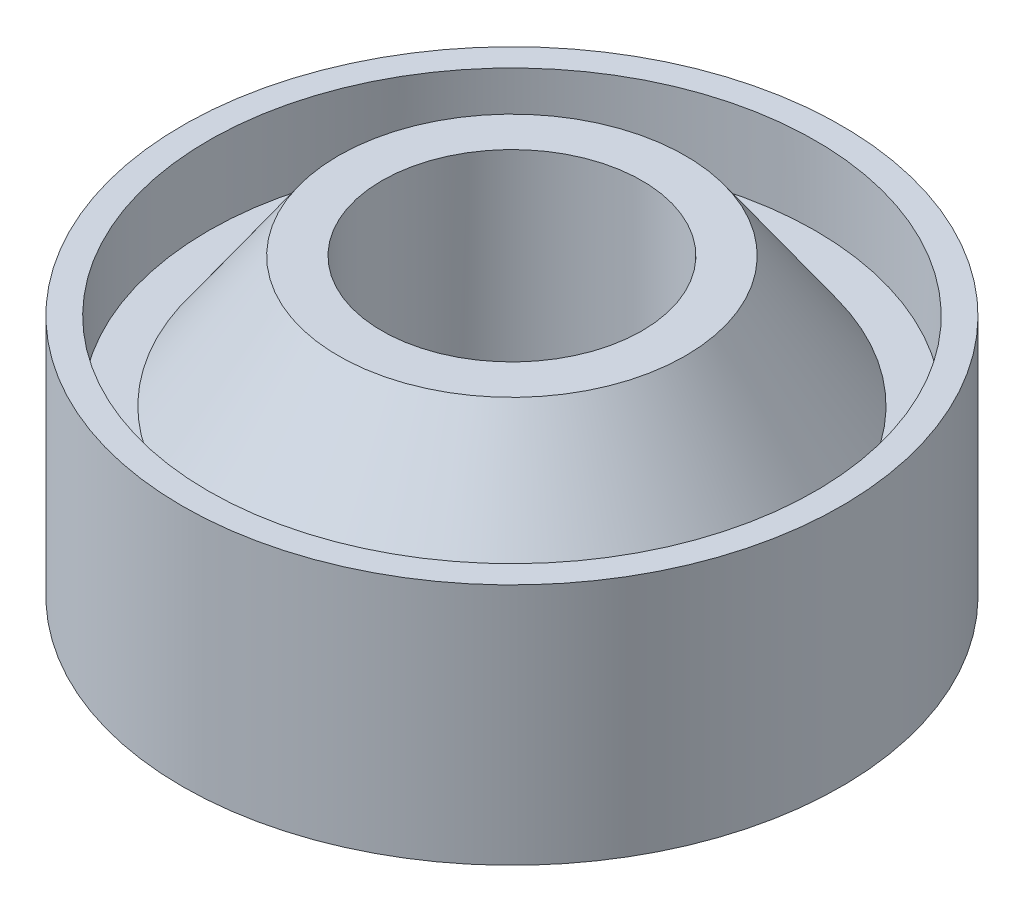
ISO-10303-21;
HEADER;
FILE_DESCRIPTION(('STEP AP214'),'2;1');
FILE_NAME('part.step','',(''),(''),'','','');
FILE_SCHEMA(('AUTOMOTIVE_DESIGN { 1 0 10303 214 1 1 1 1 }'));
ENDSEC;
DATA;
#1=APPLICATION_CONTEXT('core data for automotive mechanical design processes');
#2=APPLICATION_PROTOCOL_DEFINITION('international standard','automotive_design',2000,#1);
#3=PRODUCT_CONTEXT('',#1,'mechanical');
#4=PRODUCT('Part','Part','',(#3));
#5=PRODUCT_RELATED_PRODUCT_CATEGORY('part','',(#4));
#6=PRODUCT_DEFINITION_FORMATION('','',#4);
#7=PRODUCT_DEFINITION_CONTEXT('part definition',#1,'design');
#8=PRODUCT_DEFINITION('design','',#6,#7);
#9=PRODUCT_DEFINITION_SHAPE('','',#8);
#10=(LENGTH_UNIT() NAMED_UNIT(*) SI_UNIT(.MILLI.,.METRE.));
#11=(NAMED_UNIT(*) PLANE_ANGLE_UNIT() SI_UNIT($,.RADIAN.));
#12=(NAMED_UNIT(*) SI_UNIT($,.STERADIAN.) SOLID_ANGLE_UNIT());
#13=UNCERTAINTY_MEASURE_WITH_UNIT(LENGTH_MEASURE(1.E-05),#10,'distance_accuracy_value','');
#14=(GEOMETRIC_REPRESENTATION_CONTEXT(3) GLOBAL_UNCERTAINTY_ASSIGNED_CONTEXT((#13)) GLOBAL_UNIT_ASSIGNED_CONTEXT((#10,
#11,#12)) REPRESENTATION_CONTEXT('',''));
#15=CARTESIAN_POINT('',(0.,0.,0.));
#16=DIRECTION('',(0.,0.,1.));
#17=DIRECTION('',(1.,0.,0.));
#18=AXIS2_PLACEMENT_3D('',#15,#16,#17);
#19=CARTESIAN_POINT('',(0.,-14.,0.));
#20=DIRECTION('',(0.,1.,0.));
#21=DIRECTION('',(0.,0.,1.));
#22=AXIS2_PLACEMENT_3D('',#19,#20,#21);
#23=CYLINDRICAL_SURFACE('',#22,35.);
#24=CARTESIAN_POINT('',(0.,14.,0.));
#25=DIRECTION('',(0.,1.,0.));
#26=DIRECTION('',(0.,0.,1.));
#27=AXIS2_PLACEMENT_3D('',#24,#25,#26);
#28=CIRCLE('',#27,35.);
#29=CARTESIAN_POINT('',(0.,14.,35.));
#30=VERTEX_POINT('',#29);
#31=EDGE_CURVE('E58',#30,#30,#28,.T.);
#32=ORIENTED_EDGE('',*,*,#31,.T.);
#33=EDGE_LOOP('',(#32));
#34=FACE_BOUND('',#33,.T.);
#35=CARTESIAN_POINT('',(0.,5.,0.));
#36=DIRECTION('',(0.,-1.,0.));
#37=DIRECTION('',(1.,0.,0.));
#38=AXIS2_PLACEMENT_3D('',#35,#36,#37);
#39=CIRCLE('',#38,35.);
#40=CARTESIAN_POINT('',(35.,4.99999999999975,0.));
#41=VERTEX_POINT('',#40);
#42=EDGE_CURVE('E44',#41,#41,#39,.F.);
#43=ORIENTED_EDGE('',*,*,#42,.F.);
#44=EDGE_LOOP('',(#43));
#45=FACE_BOUND('',#44,.T.);
#46=ADVANCED_FACE('F40',(#34,#45),#23,.F.);
#47=CARTESIAN_POINT('',(0.,-14.,0.));
#48=DIRECTION('',(0.,1.,0.));
#49=DIRECTION('',(0.,0.,1.));
#50=AXIS2_PLACEMENT_3D('',#47,#48,#49);
#51=CYLINDRICAL_SURFACE('',#50,38.);
#52=CARTESIAN_POINT('',(0.,-14.,0.));
#53=DIRECTION('',(0.,1.,0.));
#54=DIRECTION('',(0.,0.,1.));
#55=AXIS2_PLACEMENT_3D('',#52,#53,#54);
#56=CIRCLE('',#55,38.);
#57=CARTESIAN_POINT('',(0.,-14.,38.));
#58=VERTEX_POINT('',#57);
#59=EDGE_CURVE('E47',#58,#58,#56,.T.);
#60=ORIENTED_EDGE('',*,*,#59,.T.);
#61=EDGE_LOOP('',(#60));
#62=FACE_BOUND('',#61,.T.);
#63=CARTESIAN_POINT('',(0.,14.,0.));
#64=DIRECTION('',(0.,1.,0.));
#65=DIRECTION('',(0.,0.,1.));
#66=AXIS2_PLACEMENT_3D('',#63,#64,#65);
#67=CIRCLE('',#66,38.);
#68=CARTESIAN_POINT('',(0.,14.,38.));
#69=VERTEX_POINT('',#68);
#70=EDGE_CURVE('E60',#69,#69,#67,.T.);
#71=ORIENTED_EDGE('',*,*,#70,.F.);
#72=EDGE_LOOP('',(#71));
#73=FACE_BOUND('',#72,.T.);
#74=ADVANCED_FACE('F99',(#62,#73),#51,.T.);
#75=CARTESIAN_POINT('',(0.,-14.,0.));
#76=DIRECTION('',(0.,1.,0.));
#77=DIRECTION('',(0.,0.,1.));
#78=AXIS2_PLACEMENT_3D('',#75,#76,#77);
#79=PLANE('',#78);
#80=CARTESIAN_POINT('',(0.,-14.,0.));
#81=DIRECTION('',(0.,1.,0.));
#82=DIRECTION('',(0.,0.,1.));
#83=AXIS2_PLACEMENT_3D('',#80,#81,#82);
#84=CIRCLE('',#83,35.);
#85=CARTESIAN_POINT('',(0.,-14.,35.));
#86=VERTEX_POINT('',#85);
#87=EDGE_CURVE('E53',#86,#86,#84,.T.);
#88=ORIENTED_EDGE('',*,*,#87,.T.);
#89=EDGE_LOOP('',(#88));
#90=FACE_BOUND('',#89,.T.);
#91=ORIENTED_EDGE('',*,*,#59,.F.);
#92=EDGE_LOOP('',(#91));
#93=FACE_BOUND('',#92,.T.);
#94=ADVANCED_FACE('F93',(#90,#93),#79,.F.);
#95=CARTESIAN_POINT('',(0.,-5.,0.));
#96=DIRECTION('',(0.,-1.,0.));
#97=DIRECTION('',(1.,0.,0.));
#98=AXIS2_PLACEMENT_3D('',#95,#96,#97);
#99=CIRCLE('',#98,35.);
#100=CARTESIAN_POINT('',(35.,-5.00000000000025,0.));
#101=VERTEX_POINT('',#100);
#102=EDGE_CURVE('E64',#101,#101,#99,.T.);
#103=ORIENTED_EDGE('',*,*,#102,.F.);
#104=EDGE_LOOP('',(#103));
#105=FACE_BOUND('',#104,.T.);
#106=ORIENTED_EDGE('',*,*,#87,.F.);
#107=EDGE_LOOP('',(#106));
#108=FACE_BOUND('',#107,.T.);
#109=ADVANCED_FACE('F94',(#105,#108),#23,.F.);
#110=CARTESIAN_POINT('',(0.,14.,0.));
#111=DIRECTION('',(0.,1.,0.));
#112=DIRECTION('',(0.,0.,1.));
#113=AXIS2_PLACEMENT_3D('',#110,#111,#112);
#114=PLANE('',#113);
#115=ORIENTED_EDGE('',*,*,#70,.T.);
#116=EDGE_LOOP('',(#115));
#117=FACE_BOUND('',#116,.T.);
#118=ORIENTED_EDGE('',*,*,#31,.F.);
#119=EDGE_LOOP('',(#118));
#120=FACE_BOUND('',#119,.T.);
#121=ADVANCED_FACE('F90',(#117,#120),#114,.T.);
#122=CARTESIAN_POINT('',(0.,-5.,0.));
#123=DIRECTION('',(0.,-1.,0.));
#124=DIRECTION('',(1.,0.,0.));
#125=AXIS2_PLACEMENT_3D('',#122,#123,#124);
#126=PLANE('',#125);
#127=CARTESIAN_POINT('',(0.,-5.,0.));
#128=DIRECTION('',(0.,-1.,0.));
#129=DIRECTION('',(1.,0.,0.));
#130=AXIS2_PLACEMENT_3D('',#127,#128,#129);
#131=CIRCLE('',#130,30.5031130731457);
#132=CARTESIAN_POINT('',(30.5031130731456,-5.00000000000021,0.));
#133=VERTEX_POINT('',#132);
#134=EDGE_CURVE('E41',#133,#133,#131,.T.);
#135=ORIENTED_EDGE('',*,*,#134,.F.);
#136=EDGE_LOOP('',(#135));
#137=FACE_BOUND('',#136,.T.);
#138=ORIENTED_EDGE('',*,*,#102,.T.);
#139=EDGE_LOOP('',(#138));
#140=FACE_BOUND('',#139,.T.);
#141=ADVANCED_FACE('F84',(#137,#140),#126,.T.);
#142=CARTESIAN_POINT('',(0.,5.,0.));
#143=DIRECTION('',(0.,-1.,0.));
#144=DIRECTION('',(1.,0.,0.));
#145=AXIS2_PLACEMENT_3D('',#142,#143,#144);
#146=PLANE('',#145);
#147=CARTESIAN_POINT('',(0.,5.,0.));
#148=DIRECTION('',(0.,-1.,0.));
#149=DIRECTION('',(1.,0.,0.));
#150=AXIS2_PLACEMENT_3D('',#147,#148,#149);
#151=CIRCLE('',#150,30.5031130731457);
#152=CARTESIAN_POINT('',(30.5031130731457,4.99999999999979,0.));
#153=VERTEX_POINT('',#152);
#154=EDGE_CURVE('E10',#153,#153,#151,.F.);
#155=ORIENTED_EDGE('',*,*,#154,.F.);
#156=EDGE_LOOP('',(#155));
#157=FACE_BOUND('',#156,.T.);
#158=ORIENTED_EDGE('',*,*,#42,.T.);
#159=EDGE_LOOP('',(#158));
#160=FACE_BOUND('',#159,.T.);
#161=ADVANCED_FACE('F88',(#157,#160),#146,.F.);
#162=CARTESIAN_POINT('',(1.39659253553725E-13,20.,0.));
#163=DIRECTION('',(0.,1.,0.));
#164=DIRECTION('',(-1.,0.,0.));
#165=AXIS2_PLACEMENT_3D('',#162,#163,#164);
#166=PLANE('',#165);
#167=CARTESIAN_POINT('',(1.39659253553725E-13,20.,0.));
#168=DIRECTION('',(0.,1.,0.));
#169=DIRECTION('',(-1.,0.,0.));
#170=AXIS2_PLACEMENT_3D('',#167,#168,#169);
#171=CIRCLE('',#170,20.);
#172=CARTESIAN_POINT('',(-19.9999999999999,20.0000000000001,0.));
#173=VERTEX_POINT('',#172);
#174=EDGE_CURVE('E68',#173,#173,#171,.T.);
#175=ORIENTED_EDGE('',*,*,#174,.T.);
#176=EDGE_LOOP('',(#175));
#177=FACE_BOUND('',#176,.T.);
#178=CARTESIAN_POINT('',(1.39659253553725E-13,20.,0.));
#179=DIRECTION('',(0.,1.,0.));
#180=DIRECTION('',(-1.,0.,0.));
#181=AXIS2_PLACEMENT_3D('',#178,#179,#180);
#182=CIRCLE('',#181,15.);
#183=CARTESIAN_POINT('',(-14.9999999999999,20.0000000000001,0.));
#184=VERTEX_POINT('',#183);
#185=EDGE_CURVE('E69',#184,#184,#182,.T.);
#186=ORIENTED_EDGE('',*,*,#185,.F.);
#187=EDGE_LOOP('',(#186));
#188=FACE_BOUND('',#187,.T.);
#189=ADVANCED_FACE('F118',(#177,#188),#166,.T.);
#190=CARTESIAN_POINT('',(1.39659253553725E-13,20.,0.));
#191=DIRECTION('',(0.,-1.,0.));
#192=DIRECTION('',(-1.,0.,0.));
#193=AXIS2_PLACEMENT_3D('',#190,#191,#192);
#194=CONICAL_SURFACE('',#193,20.,0.610865238198017);
#195=ORIENTED_EDGE('',*,*,#174,.F.);
#196=EDGE_LOOP('',(#195));
#197=FACE_BOUND('',#196,.T.);
#198=ORIENTED_EDGE('',*,*,#154,.T.);
#199=EDGE_LOOP('',(#198));
#200=FACE_BOUND('',#199,.T.);
#201=ADVANCED_FACE('F130',(#197,#200),#194,.T.);
#202=CARTESIAN_POINT('',(1.39659253553725E-13,20.,0.));
#203=DIRECTION('',(0.,-1.,0.));
#204=DIRECTION('',(1.,0.,0.));
#205=AXIS2_PLACEMENT_3D('',#202,#203,#204);
#206=CYLINDRICAL_SURFACE('',#205,15.);
#207=ORIENTED_EDGE('',*,*,#185,.T.);
#208=EDGE_LOOP('',(#207));
#209=FACE_BOUND('',#208,.T.);
#210=CARTESIAN_POINT('',(-1.39659253553725E-13,-20.,0.));
#211=DIRECTION('',(0.,-1.,0.));
#212=DIRECTION('',(1.,0.,0.));
#213=AXIS2_PLACEMENT_3D('',#210,#211,#212);
#214=CIRCLE('',#213,15.);
#215=CARTESIAN_POINT('',(14.9999999999999,-20.0000000000001,0.));
#216=VERTEX_POINT('',#215);
#217=EDGE_CURVE('E72',#216,#216,#214,.T.);
#218=ORIENTED_EDGE('',*,*,#217,.T.);
#219=EDGE_LOOP('',(#218));
#220=FACE_BOUND('',#219,.T.);
#221=ADVANCED_FACE('F128',(#209,#220),#206,.F.);
#222=CARTESIAN_POINT('',(-1.39659253553725E-13,-20.,0.));
#223=DIRECTION('',(0.,-1.,0.));
#224=DIRECTION('',(1.,0.,0.));
#225=AXIS2_PLACEMENT_3D('',#222,#223,#224);
#226=PLANE('',#225);
#227=CARTESIAN_POINT('',(-1.39659253553725E-13,-20.,0.));
#228=DIRECTION('',(0.,-1.,0.));
#229=DIRECTION('',(1.,0.,0.));
#230=AXIS2_PLACEMENT_3D('',#227,#228,#229);
#231=CIRCLE('',#230,20.);
#232=CARTESIAN_POINT('',(19.9999999999999,-20.0000000000001,0.));
#233=VERTEX_POINT('',#232);
#234=EDGE_CURVE('E71',#233,#233,#231,.T.);
#235=ORIENTED_EDGE('',*,*,#234,.T.);
#236=EDGE_LOOP('',(#235));
#237=FACE_BOUND('',#236,.T.);
#238=ORIENTED_EDGE('',*,*,#217,.F.);
#239=EDGE_LOOP('',(#238));
#240=FACE_BOUND('',#239,.T.);
#241=ADVANCED_FACE('F132',(#237,#240),#226,.T.);
#242=CARTESIAN_POINT('',(-1.39659253553725E-13,-20.,0.));
#243=DIRECTION('',(0.,1.,0.));
#244=DIRECTION('',(1.,0.,0.));
#245=AXIS2_PLACEMENT_3D('',#242,#243,#244);
#246=CONICAL_SURFACE('',#245,20.,0.610865238198017);
#247=ORIENTED_EDGE('',*,*,#234,.F.);
#248=EDGE_LOOP('',(#247));
#249=FACE_BOUND('',#248,.T.);
#250=ORIENTED_EDGE('',*,*,#134,.T.);
#251=EDGE_LOOP('',(#250));
#252=FACE_BOUND('',#251,.T.);
#253=ADVANCED_FACE('F39',(#249,#252),#246,.T.);
#254=CLOSED_SHELL('',(#46,#74,#94,#109,#121,#141,#161,#189,#201,#221,#241,#253));
#255=MANIFOLD_SOLID_BREP('B2',#254);
#256=ADVANCED_BREP_SHAPE_REPRESENTATION('',(#18,#255),#14);
#257=SHAPE_DEFINITION_REPRESENTATION(#9,#256);
ENDSEC;
END-ISO-10303-21;
